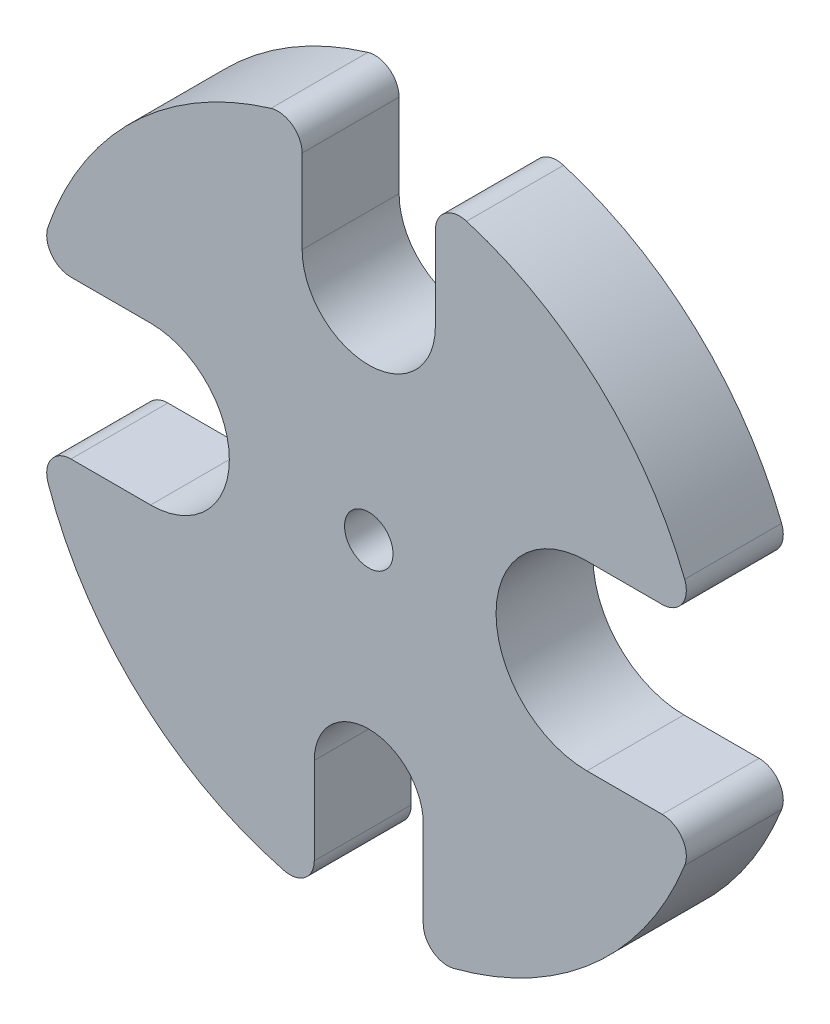
ISO-10303-21;
HEADER;
FILE_DESCRIPTION(('STEP AP214'),'2;1');
FILE_NAME('part.step','',(''),(''),'','','');
FILE_SCHEMA(('AUTOMOTIVE_DESIGN { 1 0 10303 214 1 1 1 1 }'));
ENDSEC;
DATA;
#1=APPLICATION_CONTEXT('core data for automotive mechanical design processes');
#2=APPLICATION_PROTOCOL_DEFINITION('international standard','automotive_design',2000,#1);
#3=PRODUCT_CONTEXT('',#1,'mechanical');
#4=PRODUCT('Part','Part','',(#3));
#5=PRODUCT_RELATED_PRODUCT_CATEGORY('part','',(#4));
#6=PRODUCT_DEFINITION_FORMATION('','',#4);
#7=PRODUCT_DEFINITION_CONTEXT('part definition',#1,'design');
#8=PRODUCT_DEFINITION('design','',#6,#7);
#9=PRODUCT_DEFINITION_SHAPE('','',#8);
#10=(LENGTH_UNIT() NAMED_UNIT(*) SI_UNIT(.MILLI.,.METRE.));
#11=(NAMED_UNIT(*) PLANE_ANGLE_UNIT() SI_UNIT($,.RADIAN.));
#12=(NAMED_UNIT(*) SI_UNIT($,.STERADIAN.) SOLID_ANGLE_UNIT());
#13=UNCERTAINTY_MEASURE_WITH_UNIT(LENGTH_MEASURE(1.E-05),#10,'distance_accuracy_value','');
#14=(GEOMETRIC_REPRESENTATION_CONTEXT(3) GLOBAL_UNCERTAINTY_ASSIGNED_CONTEXT((#13)) GLOBAL_UNIT_ASSIGNED_CONTEXT((#10,
#11,#12)) REPRESENTATION_CONTEXT('',''));
#15=CARTESIAN_POINT('',(0.,0.,0.));
#16=DIRECTION('',(0.,0.,1.));
#17=DIRECTION('',(1.,0.,0.));
#18=AXIS2_PLACEMENT_3D('',#15,#16,#17);
#19=CARTESIAN_POINT('',(-11.8999038146977,39.5223743542896,0.));
#20=DIRECTION('',(0.,0.,1.));
#21=DIRECTION('',(1.,0.,0.));
#22=AXIS2_PLACEMENT_3D('',#19,#20,#21);
#23=CYLINDRICAL_SURFACE('',#22,3.17500000000016);
#24=CARTESIAN_POINT('',(-11.8999038146977,39.5223743542896,12.7));
#25=DIRECTION('',(0.,0.,1.));
#26=DIRECTION('',(1.,0.,0.));
#27=AXIS2_PLACEMENT_3D('',#24,#25,#26);
#28=CIRCLE('',#27,3.17500000000016);
#29=CARTESIAN_POINT('',(-8.72490381469766,39.5223743542897,12.7));
#30=VERTEX_POINT('',#29);
#31=CARTESIAN_POINT('',(-12.8152807377747,42.5625569291853,12.7));
#32=VERTEX_POINT('',#31);
#33=EDGE_CURVE('E181',#30,#32,#28,.T.);
#34=ORIENTED_EDGE('',*,*,#33,.F.);
#35=DIRECTION('',(0.,0.,1.));
#36=VECTOR('',#35,1.);
#37=CARTESIAN_POINT('',(-8.72490381469766,39.5223743542898,6.34999999999999));
#38=LINE('',#37,#36);
#39=CARTESIAN_POINT('',(-8.72490381469766,39.5223743542897,0.));
#40=VERTEX_POINT('',#39);
#41=EDGE_CURVE('E178',#40,#30,#38,.T.);
#42=ORIENTED_EDGE('',*,*,#41,.F.);
#43=CARTESIAN_POINT('',(-11.8999038146977,39.5223743542896,0.));
#44=DIRECTION('',(0.,0.,1.));
#45=DIRECTION('',(1.,0.,0.));
#46=AXIS2_PLACEMENT_3D('',#43,#44,#45);
#47=CIRCLE('',#46,3.17500000000016);
#48=CARTESIAN_POINT('',(-12.8152807377747,42.5625569291852,0.));
#49=VERTEX_POINT('',#48);
#50=EDGE_CURVE('E21',#49,#40,#47,.F.);
#51=ORIENTED_EDGE('',*,*,#50,.F.);
#52=DIRECTION('',(0.,0.,-1.));
#53=VECTOR('',#52,1.);
#54=CARTESIAN_POINT('',(-12.8152807377746,42.5625569291853,6.35));
#55=LINE('',#54,#53);
#56=EDGE_CURVE('E242',#32,#49,#55,.T.);
#57=ORIENTED_EDGE('',*,*,#56,.F.);
#58=EDGE_LOOP('',(#34,#42,#51,#57));
#59=FACE_BOUND('',#58,.T.);
#60=ADVANCED_FACE('F17',(#59),#23,.T.);
#61=CARTESIAN_POINT('',(-3.81469748237523E-06,8.80648001570783E-07,12.7));
#62=DIRECTION('',(0.,0.,-1.));
#63=DIRECTION('',(0.,1.,0.));
#64=AXIS2_PLACEMENT_3D('',#61,#62,#63);
#65=CYLINDRICAL_SURFACE('',#64,44.4500000000004);
#66=DIRECTION('',(0.,0.,-1.));
#67=VECTOR('',#66,1.);
#68=CARTESIAN_POINT('',(-42.0098836461129,14.5248931883406,6.35));
#69=LINE('',#68,#67);
#70=CARTESIAN_POINT('',(-42.0098836461129,14.5248931883406,12.7));
#71=VERTEX_POINT('',#70);
#72=CARTESIAN_POINT('',(-42.0098836461129,14.5248931883406,0.));
#73=VERTEX_POINT('',#72);
#74=EDGE_CURVE('E240',#71,#73,#69,.T.);
#75=ORIENTED_EDGE('',*,*,#74,.F.);
#76=CARTESIAN_POINT('',(-3.81469748237523E-06,8.80648001570783E-07,12.7));
#77=DIRECTION('',(0.,0.,-1.));
#78=DIRECTION('',(0.,1.,0.));
#79=AXIS2_PLACEMENT_3D('',#76,#77,#78);
#80=CIRCLE('',#79,44.4500000000004);
#81=EDGE_CURVE('E296',#32,#71,#80,.F.);
#82=ORIENTED_EDGE('',*,*,#81,.F.);
#83=ORIENTED_EDGE('',*,*,#56,.T.);
#84=CARTESIAN_POINT('',(-3.81469748090083E-06,8.80648000035547E-07,0.));
#85=DIRECTION('',(0.,0.,-1.));
#86=DIRECTION('',(0.,1.,0.));
#87=AXIS2_PLACEMENT_3D('',#84,#85,#86);
#88=CIRCLE('',#87,44.4500000000004);
#89=EDGE_CURVE('E197',#73,#49,#88,.T.);
#90=ORIENTED_EDGE('',*,*,#89,.F.);
#91=EDGE_LOOP('',(#75,#82,#83,#90));
#92=FACE_BOUND('',#91,.T.);
#93=ADVANCED_FACE('F458',(#92),#65,.T.);
#94=CARTESIAN_POINT('',(-39.0091779438692,13.4874008806484,12.7));
#95=DIRECTION('',(0.,0.,-1.));
#96=DIRECTION('',(-1.,0.,0.));
#97=AXIS2_PLACEMENT_3D('',#94,#95,#96);
#98=CYLINDRICAL_SURFACE('',#97,3.17499999999972);
#99=CARTESIAN_POINT('',(-39.0091779438692,13.4874008806484,0.));
#100=DIRECTION('',(0.,0.,-1.));
#101=DIRECTION('',(-1.,0.,0.));
#102=AXIS2_PLACEMENT_3D('',#99,#100,#101);
#103=CIRCLE('',#102,3.17499999999972);
#104=CARTESIAN_POINT('',(-39.009177943869,10.3124008806483,0.));
#105=VERTEX_POINT('',#104);
#106=EDGE_CURVE('E301',#105,#73,#103,.T.);
#107=ORIENTED_EDGE('',*,*,#106,.F.);
#108=DIRECTION('',(0.,0.,-1.));
#109=VECTOR('',#108,1.);
#110=CARTESIAN_POINT('',(-39.0091779438688,10.3124008806483,6.34999999999999));
#111=LINE('',#110,#109);
#112=CARTESIAN_POINT('',(-39.009177943869,10.3124008806483,12.7));
#113=VERTEX_POINT('',#112);
#114=EDGE_CURVE('E238',#113,#105,#111,.T.);
#115=ORIENTED_EDGE('',*,*,#114,.F.);
#116=CARTESIAN_POINT('',(-39.0091779438692,13.4874008806484,12.7));
#117=DIRECTION('',(0.,0.,-1.));
#118=DIRECTION('',(-1.,0.,0.));
#119=AXIS2_PLACEMENT_3D('',#116,#117,#118);
#120=CIRCLE('',#119,3.17499999999972);
#121=EDGE_CURVE('E293',#71,#113,#120,.F.);
#122=ORIENTED_EDGE('',*,*,#121,.F.);
#123=ORIENTED_EDGE('',*,*,#74,.T.);
#124=EDGE_LOOP('',(#107,#115,#122,#123));
#125=FACE_BOUND('',#124,.T.);
#126=ADVANCED_FACE('F455',(#125),#98,.T.);
#127=CARTESIAN_POINT('',(-28.5650038146978,10.3124008806483,-0.0100000000000033));
#128=DIRECTION('',(0.,-1.,0.));
#129=DIRECTION('',(0.,0.,1.));
#130=AXIS2_PLACEMENT_3D('',#127,#128,#129);
#131=PLANE('',#130);
#132=DIRECTION('',(0.,0.,-1.));
#133=VECTOR('',#132,1.);
#134=CARTESIAN_POINT('',(-28.5750038146977,10.3124008806483,6.35));
#135=LINE('',#134,#133);
#136=CARTESIAN_POINT('',(-28.5750038146977,10.3124008806483,12.7));
#137=VERTEX_POINT('',#136);
#138=CARTESIAN_POINT('',(-28.5750038146977,10.3124008806483,0.));
#139=VERTEX_POINT('',#138);
#140=EDGE_CURVE('E236',#137,#139,#135,.T.);
#141=ORIENTED_EDGE('',*,*,#140,.F.);
#142=DIRECTION('',(1.,0.,0.));
#143=VECTOR('',#142,1.);
#144=CARTESIAN_POINT('',(-0.276280140841328,10.3124008806483,12.7));
#145=LINE('',#144,#143);
#146=EDGE_CURVE('E292',#113,#137,#145,.T.);
#147=ORIENTED_EDGE('',*,*,#146,.F.);
#148=ORIENTED_EDGE('',*,*,#114,.T.);
#149=DIRECTION('',(-1.,0.,0.));
#150=VECTOR('',#149,1.);
#151=CARTESIAN_POINT('',(-0.276280140841328,10.3124008806483,0.));
#152=LINE('',#151,#150);
#153=EDGE_CURVE('E303',#139,#105,#152,.T.);
#154=ORIENTED_EDGE('',*,*,#153,.F.);
#155=EDGE_LOOP('',(#141,#147,#148,#154));
#156=FACE_BOUND('',#155,.T.);
#157=ADVANCED_FACE('F451',(#156),#131,.T.);
#158=CARTESIAN_POINT('',(-28.5750038146977,8.80648313152132E-07,12.7));
#159=DIRECTION('',(0.,0.,-1.));
#160=DIRECTION('',(-1.,0.,0.));
#161=AXIS2_PLACEMENT_3D('',#158,#159,#160);
#162=CYLINDRICAL_SURFACE('',#161,10.3124);
#163=CARTESIAN_POINT('',(-28.5750038146977,8.80648313152132E-07,12.7));
#164=DIRECTION('',(0.,0.,-1.));
#165=DIRECTION('',(-1.,0.,0.));
#166=AXIS2_PLACEMENT_3D('',#163,#164,#165);
#167=CIRCLE('',#166,10.3124);
#168=CARTESIAN_POINT('',(-28.5750038146977,-10.3123991193517,12.7));
#169=VERTEX_POINT('',#168);
#170=EDGE_CURVE('E289',#137,#169,#167,.T.);
#171=ORIENTED_EDGE('',*,*,#170,.F.);
#172=ORIENTED_EDGE('',*,*,#140,.T.);
#173=CARTESIAN_POINT('',(-28.5750038146977,8.80648313152132E-07,0.));
#174=DIRECTION('',(0.,0.,-1.));
#175=DIRECTION('',(-1.,0.,0.));
#176=AXIS2_PLACEMENT_3D('',#173,#174,#175);
#177=CIRCLE('',#176,10.3124);
#178=CARTESIAN_POINT('',(-28.5750038146977,-10.3123991193517,0.));
#179=VERTEX_POINT('',#178);
#180=EDGE_CURVE('E304',#179,#139,#177,.F.);
#181=ORIENTED_EDGE('',*,*,#180,.F.);
#182=DIRECTION('',(0.,0.,-1.));
#183=VECTOR('',#182,1.);
#184=CARTESIAN_POINT('',(-28.5750038146977,-10.3123991193517,6.34999999999999));
#185=LINE('',#184,#183);
#186=EDGE_CURVE('E234',#169,#179,#185,.T.);
#187=ORIENTED_EDGE('',*,*,#186,.F.);
#188=EDGE_LOOP('',(#171,#172,#181,#187));
#189=FACE_BOUND('',#188,.T.);
#190=ADVANCED_FACE('F448',(#189),#162,.F.);
#191=CARTESIAN_POINT('',(-28.5650038146978,-10.3123991193517,12.71));
#192=DIRECTION('',(0.,1.,0.));
#193=DIRECTION('',(0.,0.,-1.));
#194=AXIS2_PLACEMENT_3D('',#191,#192,#193);
#195=PLANE('',#194);
#196=ORIENTED_EDGE('',*,*,#186,.T.);
#197=DIRECTION('',(1.,0.,0.));
#198=VECTOR('',#197,1.);
#199=CARTESIAN_POINT('',(-0.276280140841328,-10.3123991193517,0.));
#200=LINE('',#199,#198);
#201=CARTESIAN_POINT('',(-39.0091779438687,-10.3123991193517,0.));
#202=VERTEX_POINT('',#201);
#203=EDGE_CURVE('E307',#202,#179,#200,.T.);
#204=ORIENTED_EDGE('',*,*,#203,.F.);
#205=DIRECTION('',(0.,0.,-1.));
#206=VECTOR('',#205,1.);
#207=CARTESIAN_POINT('',(-39.0091779438688,-10.3123991193517,6.35));
#208=LINE('',#207,#206);
#209=CARTESIAN_POINT('',(-39.0091779438687,-10.3123991193517,12.7));
#210=VERTEX_POINT('',#209);
#211=EDGE_CURVE('E232',#210,#202,#208,.T.);
#212=ORIENTED_EDGE('',*,*,#211,.F.);
#213=DIRECTION('',(-1.,0.,0.));
#214=VECTOR('',#213,1.);
#215=CARTESIAN_POINT('',(-0.276280140841328,-10.3123991193517,12.7));
#216=LINE('',#215,#214);
#217=EDGE_CURVE('E288',#169,#210,#216,.T.);
#218=ORIENTED_EDGE('',*,*,#217,.F.);
#219=EDGE_LOOP('',(#196,#204,#212,#218));
#220=FACE_BOUND('',#219,.T.);
#221=ADVANCED_FACE('F443',(#220),#195,.T.);
#222=CARTESIAN_POINT('',(-39.0091779438687,-13.4873991193517,0.));
#223=DIRECTION('',(0.,0.,1.));
#224=DIRECTION('',(1.,0.,0.));
#225=AXIS2_PLACEMENT_3D('',#222,#223,#224);
#226=CYLINDRICAL_SURFACE('',#225,3.1750000000001);
#227=CARTESIAN_POINT('',(-39.0091779438687,-13.4873991193517,12.7));
#228=DIRECTION('',(0.,0.,1.));
#229=DIRECTION('',(1.,0.,0.));
#230=AXIS2_PLACEMENT_3D('',#227,#228,#229);
#231=CIRCLE('',#230,3.1750000000001);
#232=CARTESIAN_POINT('',(-42.0098836461127,-14.524891427044,12.7));
#233=VERTEX_POINT('',#232);
#234=EDGE_CURVE('E285',#210,#233,#231,.T.);
#235=ORIENTED_EDGE('',*,*,#234,.F.);
#236=ORIENTED_EDGE('',*,*,#211,.T.);
#237=CARTESIAN_POINT('',(-39.0091779438687,-13.4873991193517,0.));
#238=DIRECTION('',(0.,0.,1.));
#239=DIRECTION('',(1.,0.,0.));
#240=AXIS2_PLACEMENT_3D('',#237,#238,#239);
#241=CIRCLE('',#240,3.1750000000001);
#242=CARTESIAN_POINT('',(-42.0098836461127,-14.524891427044,0.));
#243=VERTEX_POINT('',#242);
#244=EDGE_CURVE('E308',#243,#202,#241,.F.);
#245=ORIENTED_EDGE('',*,*,#244,.F.);
#246=DIRECTION('',(0.,0.,-1.));
#247=VECTOR('',#246,1.);
#248=CARTESIAN_POINT('',(-42.0098836461127,-14.524891427044,6.35));
#249=LINE('',#248,#247);
#250=EDGE_CURVE('E230',#233,#243,#249,.T.);
#251=ORIENTED_EDGE('',*,*,#250,.F.);
#252=EDGE_LOOP('',(#235,#236,#245,#251));
#253=FACE_BOUND('',#252,.T.);
#254=ADVANCED_FACE('F439',(#253),#226,.T.);
#255=CARTESIAN_POINT('',(-3.8146980678444E-06,8.8064784544567E-07,12.7));
#256=DIRECTION('',(0.,0.,-1.));
#257=DIRECTION('',(-1.,0.,0.));
#258=AXIS2_PLACEMENT_3D('',#255,#256,#257);
#259=CYLINDRICAL_SURFACE('',#258,44.4499999999994);
#260=ORIENTED_EDGE('',*,*,#250,.T.);
#261=CARTESIAN_POINT('',(-3.8146980678444E-06,8.8064784544567E-07,0.));
#262=DIRECTION('',(0.,0.,-1.));
#263=DIRECTION('',(-1.,0.,0.));
#264=AXIS2_PLACEMENT_3D('',#261,#262,#263);
#265=CIRCLE('',#264,44.4499999999994);
#266=CARTESIAN_POINT('',(-11.1056653531593,-43.0402916577759,0.));
#267=VERTEX_POINT('',#266);
#268=EDGE_CURVE('E311',#267,#243,#265,.T.);
#269=ORIENTED_EDGE('',*,*,#268,.F.);
#270=DIRECTION('',(0.,0.,-1.));
#271=VECTOR('',#270,1.);
#272=CARTESIAN_POINT('',(-11.1056653531592,-43.0402916577759,6.35));
#273=LINE('',#272,#271);
#274=CARTESIAN_POINT('',(-11.1056653531593,-43.0402916577759,12.7));
#275=VERTEX_POINT('',#274);
#276=EDGE_CURVE('E228',#275,#267,#273,.T.);
#277=ORIENTED_EDGE('',*,*,#276,.F.);
#278=CARTESIAN_POINT('',(-3.8146980678444E-06,8.8064784544567E-07,12.7));
#279=DIRECTION('',(0.,0.,-1.));
#280=DIRECTION('',(-1.,0.,0.));
#281=AXIS2_PLACEMENT_3D('',#278,#279,#280);
#282=CIRCLE('',#281,44.4499999999994);
#283=EDGE_CURVE('E282',#233,#275,#282,.F.);
#284=ORIENTED_EDGE('',*,*,#283,.F.);
#285=EDGE_LOOP('',(#260,#269,#277,#284));
#286=FACE_BOUND('',#285,.T.);
#287=ADVANCED_FACE('F435',(#286),#259,.T.);
#288=CARTESIAN_POINT('',(-10.3124038146977,-39.965985047888,12.7));
#289=DIRECTION('',(0.,0.,-1.));
#290=DIRECTION('',(-1.,0.,0.));
#291=AXIS2_PLACEMENT_3D('',#288,#289,#290);
#292=CYLINDRICAL_SURFACE('',#291,3.17500000000044);
#293=CARTESIAN_POINT('',(-10.3124038146977,-39.965985047888,0.));
#294=DIRECTION('',(0.,0.,-1.));
#295=DIRECTION('',(-1.,0.,0.));
#296=AXIS2_PLACEMENT_3D('',#293,#294,#295);
#297=CIRCLE('',#296,3.17500000000044);
#298=CARTESIAN_POINT('',(-7.13740381469765,-39.9659850478883,0.));
#299=VERTEX_POINT('',#298);
#300=EDGE_CURVE('E314',#299,#267,#297,.T.);
#301=ORIENTED_EDGE('',*,*,#300,.F.);
#302=DIRECTION('',(0.,0.,-1.));
#303=VECTOR('',#302,1.);
#304=CARTESIAN_POINT('',(-7.13740381469763,-39.9659850478886,6.34999999999999));
#305=LINE('',#304,#303);
#306=CARTESIAN_POINT('',(-7.13740381469764,-39.9659850478883,12.7));
#307=VERTEX_POINT('',#306);
#308=EDGE_CURVE('E226',#307,#299,#305,.T.);
#309=ORIENTED_EDGE('',*,*,#308,.F.);
#310=CARTESIAN_POINT('',(-10.3124038146977,-39.965985047888,12.7));
#311=DIRECTION('',(0.,0.,-1.));
#312=DIRECTION('',(-1.,0.,0.));
#313=AXIS2_PLACEMENT_3D('',#310,#311,#312);
#314=CIRCLE('',#313,3.17500000000044);
#315=EDGE_CURVE('E279',#275,#307,#314,.F.);
#316=ORIENTED_EDGE('',*,*,#315,.F.);
#317=ORIENTED_EDGE('',*,*,#276,.T.);
#318=EDGE_LOOP('',(#301,#309,#316,#317));
#319=FACE_BOUND('',#318,.T.);
#320=ADVANCED_FACE('F431',(#319),#292,.T.);
#321=CARTESIAN_POINT('',(-7.13740381469766,-28.5649991193516,-0.0100000000000033));
#322=DIRECTION('',(1.,0.,0.));
#323=DIRECTION('',(0.,0.,1.));
#324=AXIS2_PLACEMENT_3D('',#321,#322,#323);
#325=PLANE('',#324);
#326=DIRECTION('',(0.,0.,-1.));
#327=VECTOR('',#326,1.);
#328=CARTESIAN_POINT('',(-7.13740381469766,-28.5749991193518,6.35));
#329=LINE('',#328,#327);
#330=CARTESIAN_POINT('',(-7.13740381469765,-28.5749991193518,12.7));
#331=VERTEX_POINT('',#330);
#332=CARTESIAN_POINT('',(-7.13740381469766,-28.5749991193518,0.));
#333=VERTEX_POINT('',#332);
#334=EDGE_CURVE('E224',#331,#333,#329,.T.);
#335=ORIENTED_EDGE('',*,*,#334,.F.);
#336=DIRECTION('',(0.,1.,0.));
#337=VECTOR('',#336,1.);
#338=CARTESIAN_POINT('',(-7.13740381469764,-0.203236700360557,12.7));
#339=LINE('',#338,#337);
#340=EDGE_CURVE('E278',#307,#331,#339,.T.);
#341=ORIENTED_EDGE('',*,*,#340,.F.);
#342=ORIENTED_EDGE('',*,*,#308,.T.);
#343=DIRECTION('',(0.,-1.,0.));
#344=VECTOR('',#343,1.);
#345=CARTESIAN_POINT('',(-7.13740381469766,-0.203236700360557,0.));
#346=LINE('',#345,#344);
#347=EDGE_CURVE('E317',#333,#299,#346,.T.);
#348=ORIENTED_EDGE('',*,*,#347,.F.);
#349=EDGE_LOOP('',(#335,#341,#342,#348));
#350=FACE_BOUND('',#349,.T.);
#351=ADVANCED_FACE('F427',(#350),#325,.T.);
#352=CARTESIAN_POINT('',(-3.81469764044559E-06,-28.5749991193518,12.7));
#353=DIRECTION('',(0.,0.,-1.));
#354=DIRECTION('',(-1.,0.,0.));
#355=AXIS2_PLACEMENT_3D('',#352,#353,#354);
#356=CYLINDRICAL_SURFACE('',#355,7.13740000000007);
#357=CARTESIAN_POINT('',(-3.81469764044559E-06,-28.5749991193518,12.7));
#358=DIRECTION('',(0.,0.,-1.));
#359=DIRECTION('',(-1.,0.,0.));
#360=AXIS2_PLACEMENT_3D('',#357,#358,#359);
#361=CIRCLE('',#360,7.13740000000007);
#362=CARTESIAN_POINT('',(7.13739618530235,-28.5749991193518,12.7));
#363=VERTEX_POINT('',#362);
#364=EDGE_CURVE('E275',#331,#363,#361,.T.);
#365=ORIENTED_EDGE('',*,*,#364,.F.);
#366=ORIENTED_EDGE('',*,*,#334,.T.);
#367=CARTESIAN_POINT('',(-3.81469764044559E-06,-28.5749991193518,0.));
#368=DIRECTION('',(0.,0.,-1.));
#369=DIRECTION('',(-1.,0.,0.));
#370=AXIS2_PLACEMENT_3D('',#367,#368,#369);
#371=CIRCLE('',#370,7.13740000000007);
#372=CARTESIAN_POINT('',(7.13739618530236,-28.5749991193518,0.));
#373=VERTEX_POINT('',#372);
#374=EDGE_CURVE('E318',#373,#333,#371,.F.);
#375=ORIENTED_EDGE('',*,*,#374,.F.);
#376=DIRECTION('',(0.,0.,-1.));
#377=VECTOR('',#376,1.);
#378=CARTESIAN_POINT('',(7.13739618530235,-28.5749991193518,6.34999999999999));
#379=LINE('',#378,#377);
#380=EDGE_CURVE('E222',#363,#373,#379,.T.);
#381=ORIENTED_EDGE('',*,*,#380,.F.);
#382=EDGE_LOOP('',(#365,#366,#375,#381));
#383=FACE_BOUND('',#382,.T.);
#384=ADVANCED_FACE('F424',(#383),#356,.F.);
#385=CARTESIAN_POINT('',(7.13739618530235,-28.5649991193516,12.71));
#386=DIRECTION('',(-1.,0.,0.));
#387=DIRECTION('',(0.,0.,-1.));
#388=AXIS2_PLACEMENT_3D('',#385,#386,#387);
#389=PLANE('',#388);
#390=ORIENTED_EDGE('',*,*,#380,.T.);
#391=DIRECTION('',(0.,1.,0.));
#392=VECTOR('',#391,1.);
#393=CARTESIAN_POINT('',(7.13739618530238,-0.203236700360557,0.));
#394=LINE('',#393,#392);
#395=CARTESIAN_POINT('',(7.13739618530237,-39.9659850478883,0.));
#396=VERTEX_POINT('',#395);
#397=EDGE_CURVE('E321',#396,#373,#394,.T.);
#398=ORIENTED_EDGE('',*,*,#397,.F.);
#399=DIRECTION('',(0.,0.,-1.));
#400=VECTOR('',#399,1.);
#401=CARTESIAN_POINT('',(7.13739618530237,-39.9659850478886,6.35));
#402=LINE('',#401,#400);
#403=CARTESIAN_POINT('',(7.13739618530236,-39.9659850478883,12.7));
#404=VERTEX_POINT('',#403);
#405=EDGE_CURVE('E220',#404,#396,#402,.T.);
#406=ORIENTED_EDGE('',*,*,#405,.F.);
#407=DIRECTION('',(0.,-1.,0.));
#408=VECTOR('',#407,1.);
#409=CARTESIAN_POINT('',(7.13739618530235,-0.203236700360557,12.7));
#410=LINE('',#409,#408);
#411=EDGE_CURVE('E274',#363,#404,#410,.T.);
#412=ORIENTED_EDGE('',*,*,#411,.F.);
#413=EDGE_LOOP('',(#390,#398,#406,#412));
#414=FACE_BOUND('',#413,.T.);
#415=ADVANCED_FACE('F419',(#414),#389,.T.);
#416=CARTESIAN_POINT('',(10.3123961853024,-39.965985047888,0.));
#417=DIRECTION('',(0.,0.,1.));
#418=DIRECTION('',(1.,0.,0.));
#419=AXIS2_PLACEMENT_3D('',#416,#417,#418);
#420=CYLINDRICAL_SURFACE('',#419,3.17500000000044);
#421=CARTESIAN_POINT('',(10.3123961853024,-39.965985047888,12.7));
#422=DIRECTION('',(0.,0.,1.));
#423=DIRECTION('',(1.,0.,0.));
#424=AXIS2_PLACEMENT_3D('',#421,#422,#423);
#425=CIRCLE('',#424,3.17500000000044);
#426=CARTESIAN_POINT('',(11.105657723764,-43.0402916577759,12.7));
#427=VERTEX_POINT('',#426);
#428=EDGE_CURVE('E271',#404,#427,#425,.T.);
#429=ORIENTED_EDGE('',*,*,#428,.F.);
#430=ORIENTED_EDGE('',*,*,#405,.T.);
#431=CARTESIAN_POINT('',(10.3123961853024,-39.965985047888,0.));
#432=DIRECTION('',(0.,0.,1.));
#433=DIRECTION('',(1.,0.,0.));
#434=AXIS2_PLACEMENT_3D('',#431,#432,#433);
#435=CIRCLE('',#434,3.17500000000044);
#436=CARTESIAN_POINT('',(11.105657723764,-43.0402916577759,0.));
#437=VERTEX_POINT('',#436);
#438=EDGE_CURVE('E322',#437,#396,#435,.F.);
#439=ORIENTED_EDGE('',*,*,#438,.F.);
#440=DIRECTION('',(0.,0.,-1.));
#441=VECTOR('',#440,1.);
#442=CARTESIAN_POINT('',(11.1056577237639,-43.0402916577759,6.35));
#443=LINE('',#442,#441);
#444=EDGE_CURVE('E218',#427,#437,#443,.T.);
#445=ORIENTED_EDGE('',*,*,#444,.F.);
#446=EDGE_LOOP('',(#429,#430,#439,#445));
#447=FACE_BOUND('',#446,.T.);
#448=ADVANCED_FACE('F415',(#447),#420,.T.);
#449=CARTESIAN_POINT('',(-3.81469795508738E-06,8.80648774390091E-07,12.7));
#450=DIRECTION('',(0.,0.,-1.));
#451=DIRECTION('',(0.,1.,0.));
#452=AXIS2_PLACEMENT_3D('',#449,#450,#451);
#453=CYLINDRICAL_SURFACE('',#452,44.4500000000005);
#454=DIRECTION('',(0.,0.,-1.));
#455=VECTOR('',#454,1.);
#456=CARTESIAN_POINT('',(41.3792574158802,-16.2345068116594,6.35));
#457=LINE('',#456,#455);
#458=CARTESIAN_POINT('',(41.3792574158802,-16.2345068116594,12.7));
#459=VERTEX_POINT('',#458);
#460=CARTESIAN_POINT('',(41.3792574158802,-16.2345068116594,0.));
#461=VERTEX_POINT('',#460);
#462=EDGE_CURVE('E216',#459,#461,#457,.T.);
#463=ORIENTED_EDGE('',*,*,#462,.F.);
#464=CARTESIAN_POINT('',(-3.81469795508738E-06,8.80648774390091E-07,12.7));
#465=DIRECTION('',(0.,0.,-1.));
#466=DIRECTION('',(0.,1.,0.));
#467=AXIS2_PLACEMENT_3D('',#464,#465,#466);
#468=CIRCLE('',#467,44.4500000000005);
#469=EDGE_CURVE('E268',#427,#459,#468,.F.);
#470=ORIENTED_EDGE('',*,*,#469,.F.);
#471=ORIENTED_EDGE('',*,*,#444,.T.);
#472=CARTESIAN_POINT('',(-3.81469795650177E-06,8.80648775987461E-07,0.));
#473=DIRECTION('',(0.,0.,-1.));
#474=DIRECTION('',(0.,1.,0.));
#475=AXIS2_PLACEMENT_3D('',#472,#473,#474);
#476=CIRCLE('',#475,44.4500000000005);
#477=EDGE_CURVE('E325',#461,#437,#476,.T.);
#478=ORIENTED_EDGE('',*,*,#477,.F.);
#479=EDGE_LOOP('',(#463,#470,#471,#478));
#480=FACE_BOUND('',#479,.T.);
#481=ADVANCED_FACE('F411',(#480),#453,.T.);
#482=CARTESIAN_POINT('',(38.4235958994101,-15.0748991193517,12.7));
#483=DIRECTION('',(0.,0.,-1.));
#484=DIRECTION('',(-1.,0.,0.));
#485=AXIS2_PLACEMENT_3D('',#482,#483,#484);
#486=CYLINDRICAL_SURFACE('',#485,3.17500000000026);
#487=CARTESIAN_POINT('',(38.4235958994101,-15.0748991193517,0.));
#488=DIRECTION('',(0.,0.,-1.));
#489=DIRECTION('',(-1.,0.,0.));
#490=AXIS2_PLACEMENT_3D('',#487,#488,#489);
#491=CIRCLE('',#490,3.17500000000026);
#492=CARTESIAN_POINT('',(38.4235958994103,-11.8998991193517,0.));
#493=VERTEX_POINT('',#492);
#494=EDGE_CURVE('E328',#493,#461,#491,.T.);
#495=ORIENTED_EDGE('',*,*,#494,.F.);
#496=DIRECTION('',(0.,0.,-1.));
#497=VECTOR('',#496,1.);
#498=CARTESIAN_POINT('',(38.4235958994104,-11.8998991193517,6.34999999999999));
#499=LINE('',#498,#497);
#500=CARTESIAN_POINT('',(38.4235958994103,-11.8998991193517,12.7));
#501=VERTEX_POINT('',#500);
#502=EDGE_CURVE('E214',#501,#493,#499,.T.);
#503=ORIENTED_EDGE('',*,*,#502,.F.);
#504=CARTESIAN_POINT('',(38.4235958994101,-15.0748991193517,12.7));
#505=DIRECTION('',(0.,0.,-1.));
#506=DIRECTION('',(-1.,0.,0.));
#507=AXIS2_PLACEMENT_3D('',#504,#505,#506);
#508=CIRCLE('',#507,3.17500000000026);
#509=EDGE_CURVE('E265',#459,#501,#508,.F.);
#510=ORIENTED_EDGE('',*,*,#509,.F.);
#511=ORIENTED_EDGE('',*,*,#462,.T.);
#512=EDGE_LOOP('',(#495,#503,#510,#511));
#513=FACE_BOUND('',#512,.T.);
#514=ADVANCED_FACE('F407',(#513),#486,.T.);
#515=CARTESIAN_POINT('',(38.4335958994104,-11.8998991193517,12.71));
#516=DIRECTION('',(0.,1.,0.));
#517=DIRECTION('',(0.,0.,-1.));
#518=AXIS2_PLACEMENT_3D('',#515,#516,#517);
#519=PLANE('',#518);
#520=DIRECTION('',(0.,0.,-1.));
#521=VECTOR('',#520,1.);
#522=CARTESIAN_POINT('',(28.5749961853023,-11.8998991193517,6.35));
#523=LINE('',#522,#521);
#524=CARTESIAN_POINT('',(28.5749961853023,-11.8998991193517,12.7));
#525=VERTEX_POINT('',#524);
#526=CARTESIAN_POINT('',(28.5749961853023,-11.8998991193517,0.));
#527=VERTEX_POINT('',#526);
#528=EDGE_CURVE('E212',#525,#527,#523,.T.);
#529=ORIENTED_EDGE('',*,*,#528,.F.);
#530=DIRECTION('',(-1.,0.,0.));
#531=VECTOR('',#530,1.);
#532=CARTESIAN_POINT('',(-0.276280140841328,-11.8998991193517,12.7));
#533=LINE('',#532,#531);
#534=EDGE_CURVE('E264',#501,#525,#533,.T.);
#535=ORIENTED_EDGE('',*,*,#534,.F.);
#536=ORIENTED_EDGE('',*,*,#502,.T.);
#537=DIRECTION('',(1.,0.,0.));
#538=VECTOR('',#537,1.);
#539=CARTESIAN_POINT('',(-0.276280140841328,-11.8998991193517,0.));
#540=LINE('',#539,#538);
#541=EDGE_CURVE('E331',#527,#493,#540,.T.);
#542=ORIENTED_EDGE('',*,*,#541,.F.);
#543=EDGE_LOOP('',(#529,#535,#536,#542));
#544=FACE_BOUND('',#543,.T.);
#545=ADVANCED_FACE('F403',(#544),#519,.T.);
#546=CARTESIAN_POINT('',(28.5749961853023,8.80648319973715E-07,12.7));
#547=DIRECTION('',(0.,0.,-1.));
#548=DIRECTION('',(-1.,0.,0.));
#549=AXIS2_PLACEMENT_3D('',#546,#547,#548);
#550=CYLINDRICAL_SURFACE('',#549,11.8999);
#551=CARTESIAN_POINT('',(28.5749961853023,8.80648319973715E-07,12.7));
#552=DIRECTION('',(0.,0.,-1.));
#553=DIRECTION('',(-1.,0.,0.));
#554=AXIS2_PLACEMENT_3D('',#551,#552,#553);
#555=CIRCLE('',#554,11.8999);
#556=CARTESIAN_POINT('',(28.5749961853023,11.8999008806483,12.7));
#557=VERTEX_POINT('',#556);
#558=EDGE_CURVE('E261',#525,#557,#555,.T.);
#559=ORIENTED_EDGE('',*,*,#558,.F.);
#560=ORIENTED_EDGE('',*,*,#528,.T.);
#561=CARTESIAN_POINT('',(28.5749961853023,8.80648319973715E-07,0.));
#562=DIRECTION('',(0.,0.,-1.));
#563=DIRECTION('',(-1.,0.,0.));
#564=AXIS2_PLACEMENT_3D('',#561,#562,#563);
#565=CIRCLE('',#564,11.8999);
#566=CARTESIAN_POINT('',(28.5749961853023,11.8999008806483,0.));
#567=VERTEX_POINT('',#566);
#568=EDGE_CURVE('E332',#567,#527,#565,.F.);
#569=ORIENTED_EDGE('',*,*,#568,.F.);
#570=DIRECTION('',(0.,0.,-1.));
#571=VECTOR('',#570,1.);
#572=CARTESIAN_POINT('',(28.5749961853023,11.8999008806483,6.34999999999999));
#573=LINE('',#572,#571);
#574=EDGE_CURVE('E210',#557,#567,#573,.T.);
#575=ORIENTED_EDGE('',*,*,#574,.F.);
#576=EDGE_LOOP('',(#559,#560,#569,#575));
#577=FACE_BOUND('',#576,.T.);
#578=ADVANCED_FACE('F400',(#577),#550,.F.);
#579=CARTESIAN_POINT('',(38.4335958994104,11.8999008806483,-0.0100000000000033));
#580=DIRECTION('',(0.,-1.,0.));
#581=DIRECTION('',(0.,0.,1.));
#582=AXIS2_PLACEMENT_3D('',#579,#580,#581);
#583=PLANE('',#582);
#584=ORIENTED_EDGE('',*,*,#574,.T.);
#585=DIRECTION('',(-1.,0.,0.));
#586=VECTOR('',#585,1.);
#587=CARTESIAN_POINT('',(-0.276280140841325,11.8999008806483,0.));
#588=LINE('',#587,#586);
#589=CARTESIAN_POINT('',(38.4235958994102,11.8999008806483,0.));
#590=VERTEX_POINT('',#589);
#591=EDGE_CURVE('E335',#590,#567,#588,.T.);
#592=ORIENTED_EDGE('',*,*,#591,.F.);
#593=DIRECTION('',(0.,0.,-1.));
#594=VECTOR('',#593,1.);
#595=CARTESIAN_POINT('',(38.4235958994104,11.8999008806483,6.35));
#596=LINE('',#595,#594);
#597=CARTESIAN_POINT('',(38.4235958994102,11.8999008806483,12.7));
#598=VERTEX_POINT('',#597);
#599=EDGE_CURVE('E208',#598,#590,#596,.T.);
#600=ORIENTED_EDGE('',*,*,#599,.F.);
#601=DIRECTION('',(1.,0.,0.));
#602=VECTOR('',#601,1.);
#603=CARTESIAN_POINT('',(-0.276280140841325,11.8999008806483,12.7));
#604=LINE('',#603,#602);
#605=EDGE_CURVE('E260',#557,#598,#604,.T.);
#606=ORIENTED_EDGE('',*,*,#605,.F.);
#607=EDGE_LOOP('',(#584,#592,#600,#606));
#608=FACE_BOUND('',#607,.T.);
#609=ADVANCED_FACE('F395',(#608),#583,.T.);
#610=CARTESIAN_POINT('',(38.4235958994101,15.0749008806484,0.));
#611=DIRECTION('',(0.,0.,1.));
#612=DIRECTION('',(1.,0.,0.));
#613=AXIS2_PLACEMENT_3D('',#610,#611,#612);
#614=CYLINDRICAL_SURFACE('',#613,3.17500000000029);
#615=CARTESIAN_POINT('',(38.4235958994101,15.0749008806484,12.7));
#616=DIRECTION('',(0.,0.,1.));
#617=DIRECTION('',(1.,0.,0.));
#618=AXIS2_PLACEMENT_3D('',#615,#616,#617);
#619=CIRCLE('',#618,3.17500000000029);
#620=CARTESIAN_POINT('',(41.3792574158802,16.2345085729561,12.7));
#621=VERTEX_POINT('',#620);
#622=EDGE_CURVE('E257',#598,#621,#619,.T.);
#623=ORIENTED_EDGE('',*,*,#622,.F.);
#624=ORIENTED_EDGE('',*,*,#599,.T.);
#625=CARTESIAN_POINT('',(38.4235958994101,15.0749008806484,0.));
#626=DIRECTION('',(0.,0.,1.));
#627=DIRECTION('',(1.,0.,0.));
#628=AXIS2_PLACEMENT_3D('',#625,#626,#627);
#629=CIRCLE('',#628,3.17500000000029);
#630=CARTESIAN_POINT('',(41.3792574158802,16.2345085729561,0.));
#631=VERTEX_POINT('',#630);
#632=EDGE_CURVE('E336',#631,#590,#629,.F.);
#633=ORIENTED_EDGE('',*,*,#632,.F.);
#634=DIRECTION('',(0.,0.,-1.));
#635=VECTOR('',#634,1.);
#636=CARTESIAN_POINT('',(41.3792574158802,16.234508572956,6.35));
#637=LINE('',#636,#635);
#638=EDGE_CURVE('E206',#621,#631,#637,.T.);
#639=ORIENTED_EDGE('',*,*,#638,.F.);
#640=EDGE_LOOP('',(#623,#624,#633,#639));
#641=FACE_BOUND('',#640,.T.);
#642=ADVANCED_FACE('F391',(#641),#614,.T.);
#643=CARTESIAN_POINT('',(-3.81469781804422E-06,8.80648082235425E-07,12.7));
#644=DIRECTION('',(0.,0.,-1.));
#645=DIRECTION('',(-1.,0.,0.));
#646=AXIS2_PLACEMENT_3D('',#643,#644,#645);
#647=CYLINDRICAL_SURFACE('',#646,44.4500000000003);
#648=DIRECTION('',(0.,0.,-1.));
#649=VECTOR('',#648,1.);
#650=CARTESIAN_POINT('',(12.8152731083793,42.5625569291853,6.35));
#651=LINE('',#650,#649);
#652=CARTESIAN_POINT('',(12.8152731083793,42.5625569291852,12.7));
#653=VERTEX_POINT('',#652);
#654=CARTESIAN_POINT('',(12.8152731083793,42.5625569291853,0.));
#655=VERTEX_POINT('',#654);
#656=EDGE_CURVE('E204',#653,#655,#651,.T.);
#657=ORIENTED_EDGE('',*,*,#656,.F.);
#658=CARTESIAN_POINT('',(-3.81469781804422E-06,8.80648082235425E-07,12.7));
#659=DIRECTION('',(0.,0.,-1.));
#660=DIRECTION('',(-1.,0.,0.));
#661=AXIS2_PLACEMENT_3D('',#658,#659,#660);
#662=CIRCLE('',#661,44.4500000000003);
#663=EDGE_CURVE('E254',#621,#653,#662,.F.);
#664=ORIENTED_EDGE('',*,*,#663,.F.);
#665=ORIENTED_EDGE('',*,*,#638,.T.);
#666=CARTESIAN_POINT('',(-3.81469781804422E-06,8.80648082235425E-07,0.));
#667=DIRECTION('',(0.,0.,-1.));
#668=DIRECTION('',(-1.,0.,0.));
#669=AXIS2_PLACEMENT_3D('',#666,#667,#668);
#670=CIRCLE('',#669,44.4500000000003);
#671=EDGE_CURVE('E339',#655,#631,#670,.T.);
#672=ORIENTED_EDGE('',*,*,#671,.F.);
#673=EDGE_LOOP('',(#657,#664,#665,#672));
#674=FACE_BOUND('',#673,.T.);
#675=ADVANCED_FACE('F387',(#674),#647,.T.);
#676=CARTESIAN_POINT('',(11.8998961853024,39.5223743542896,12.7));
#677=DIRECTION('',(0.,0.,-1.));
#678=DIRECTION('',(0.,1.,0.));
#679=AXIS2_PLACEMENT_3D('',#676,#677,#678);
#680=CYLINDRICAL_SURFACE('',#679,3.17500000000013);
#681=CARTESIAN_POINT('',(11.8998961853024,39.5223743542896,0.));
#682=DIRECTION('',(0.,0.,-1.));
#683=DIRECTION('',(0.,1.,0.));
#684=AXIS2_PLACEMENT_3D('',#681,#682,#683);
#685=CIRCLE('',#684,3.17500000000013);
#686=CARTESIAN_POINT('',(8.72489618530235,39.5223743542897,0.));
#687=VERTEX_POINT('',#686);
#688=EDGE_CURVE('E342',#687,#655,#685,.T.);
#689=ORIENTED_EDGE('',*,*,#688,.F.);
#690=DIRECTION('',(0.,0.,-1.));
#691=VECTOR('',#690,1.);
#692=CARTESIAN_POINT('',(8.72489618530235,39.5223743542898,6.34999999999999));
#693=LINE('',#692,#691);
#694=CARTESIAN_POINT('',(8.72489618530235,39.5223743542897,12.7));
#695=VERTEX_POINT('',#694);
#696=EDGE_CURVE('E202',#695,#687,#693,.T.);
#697=ORIENTED_EDGE('',*,*,#696,.F.);
#698=CARTESIAN_POINT('',(11.8998961853024,39.5223743542896,12.7));
#699=DIRECTION('',(0.,0.,-1.));
#700=DIRECTION('',(0.,1.,0.));
#701=AXIS2_PLACEMENT_3D('',#698,#699,#700);
#702=CIRCLE('',#701,3.17500000000013);
#703=EDGE_CURVE('E251',#653,#695,#702,.F.);
#704=ORIENTED_EDGE('',*,*,#703,.F.);
#705=ORIENTED_EDGE('',*,*,#656,.T.);
#706=EDGE_LOOP('',(#689,#697,#704,#705));
#707=FACE_BOUND('',#706,.T.);
#708=ADVANCED_FACE('F383',(#707),#680,.T.);
#709=CARTESIAN_POINT('',(8.72489618530235,39.5323743542898,12.71));
#710=DIRECTION('',(-1.,0.,0.));
#711=DIRECTION('',(0.,0.,-1.));
#712=AXIS2_PLACEMENT_3D('',#709,#710,#711);
#713=PLANE('',#712);
#714=DIRECTION('',(0.,0.,-1.));
#715=VECTOR('',#714,1.);
#716=CARTESIAN_POINT('',(8.72489618530235,28.5750008806482,6.35));
#717=LINE('',#716,#715);
#718=CARTESIAN_POINT('',(8.72489618530235,28.5750008806482,12.7));
#719=VERTEX_POINT('',#718);
#720=CARTESIAN_POINT('',(8.72489618530235,28.5750008806482,0.));
#721=VERTEX_POINT('',#720);
#722=EDGE_CURVE('E184',#719,#721,#717,.T.);
#723=ORIENTED_EDGE('',*,*,#722,.F.);
#724=DIRECTION('',(0.,-1.,0.));
#725=VECTOR('',#724,1.);
#726=CARTESIAN_POINT('',(8.72489618530235,-0.203236700360557,12.7));
#727=LINE('',#726,#725);
#728=EDGE_CURVE('E250',#695,#719,#727,.T.);
#729=ORIENTED_EDGE('',*,*,#728,.F.);
#730=ORIENTED_EDGE('',*,*,#696,.T.);
#731=DIRECTION('',(0.,1.,0.));
#732=VECTOR('',#731,1.);
#733=CARTESIAN_POINT('',(8.72489618530235,-0.203236700360557,0.));
#734=LINE('',#733,#732);
#735=EDGE_CURVE('E344',#721,#687,#734,.T.);
#736=ORIENTED_EDGE('',*,*,#735,.F.);
#737=EDGE_LOOP('',(#723,#729,#730,#736));
#738=FACE_BOUND('',#737,.T.);
#739=ADVANCED_FACE('F379',(#738),#713,.T.);
#740=CARTESIAN_POINT('',(-3.81469765455697E-06,28.5750008806482,12.7));
#741=DIRECTION('',(0.,0.,-1.));
#742=DIRECTION('',(-1.,0.,0.));
#743=AXIS2_PLACEMENT_3D('',#740,#741,#742);
#744=CYLINDRICAL_SURFACE('',#743,8.72489999999996);
#745=CARTESIAN_POINT('',(-3.81469765455697E-06,28.5750008806482,12.7));
#746=DIRECTION('',(0.,0.,-1.));
#747=DIRECTION('',(-1.,0.,0.));
#748=AXIS2_PLACEMENT_3D('',#745,#746,#747);
#749=CIRCLE('',#748,8.72489999999996);
#750=CARTESIAN_POINT('',(-8.72490381469766,28.5750008806482,12.7));
#751=VERTEX_POINT('',#750);
#752=EDGE_CURVE('E247',#719,#751,#749,.T.);
#753=ORIENTED_EDGE('',*,*,#752,.F.);
#754=ORIENTED_EDGE('',*,*,#722,.T.);
#755=CARTESIAN_POINT('',(-3.81469765455697E-06,28.5750008806482,0.));
#756=DIRECTION('',(0.,0.,-1.));
#757=DIRECTION('',(-1.,0.,0.));
#758=AXIS2_PLACEMENT_3D('',#755,#756,#757);
#759=CIRCLE('',#758,8.72489999999996);
#760=CARTESIAN_POINT('',(-8.72490381469766,28.5750008806482,0.));
#761=VERTEX_POINT('',#760);
#762=EDGE_CURVE('E191',#761,#721,#759,.F.);
#763=ORIENTED_EDGE('',*,*,#762,.F.);
#764=DIRECTION('',(0.,0.,-1.));
#765=VECTOR('',#764,1.);
#766=CARTESIAN_POINT('',(-8.72490381469766,28.5750008806482,6.34999999999999));
#767=LINE('',#766,#765);
#768=EDGE_CURVE('E36',#751,#761,#767,.T.);
#769=ORIENTED_EDGE('',*,*,#768,.F.);
#770=EDGE_LOOP('',(#753,#754,#763,#769));
#771=FACE_BOUND('',#770,.T.);
#772=ADVANCED_FACE('F377',(#771),#744,.F.);
#773=CARTESIAN_POINT('',(-8.72490381469766,39.5323743542898,-0.0100000000000033));
#774=DIRECTION('',(1.,0.,0.));
#775=DIRECTION('',(0.,0.,1.));
#776=AXIS2_PLACEMENT_3D('',#773,#774,#775);
#777=PLANE('',#776);
#778=ORIENTED_EDGE('',*,*,#768,.T.);
#779=DIRECTION('',(0.,-1.,0.));
#780=VECTOR('',#779,1.);
#781=CARTESIAN_POINT('',(-8.72490381469766,-0.203236700360557,0.));
#782=LINE('',#781,#780);
#783=EDGE_CURVE('E187',#40,#761,#782,.T.);
#784=ORIENTED_EDGE('',*,*,#783,.F.);
#785=ORIENTED_EDGE('',*,*,#41,.T.);
#786=DIRECTION('',(0.,1.,0.));
#787=VECTOR('',#786,1.);
#788=CARTESIAN_POINT('',(-8.72490381469765,-0.203236700360557,12.7));
#789=LINE('',#788,#787);
#790=EDGE_CURVE('E246',#751,#30,#789,.T.);
#791=ORIENTED_EDGE('',*,*,#790,.F.);
#792=EDGE_LOOP('',(#778,#784,#785,#791));
#793=FACE_BOUND('',#792,.T.);
#794=ADVANCED_FACE('F188',(#793),#777,.T.);
#795=CARTESIAN_POINT('',(-42.5546443306094,43.0327267237138,0.));
#796=DIRECTION('',(0.,0.,-1.));
#797=DIRECTION('',(1.,0.,0.));
#798=AXIS2_PLACEMENT_3D('',#795,#796,#797);
#799=PLANE('',#798);
#800=CARTESIAN_POINT('',(-3.8146976519307E-06,8.80648314674616E-07,0.));
#801=DIRECTION('',(0.,0.,1.));
#802=DIRECTION('',(1.,0.,0.));
#803=AXIS2_PLACEMENT_3D('',#800,#801,#802);
#804=CIRCLE('',#803,3.17499999999999);
#805=CARTESIAN_POINT('',(3.17499618530234,8.80648314674616E-07,0.));
#806=VERTEX_POINT('',#805);
#807=EDGE_CURVE('E27',#806,#806,#804,.F.);
#808=ORIENTED_EDGE('',*,*,#807,.F.);
#809=EDGE_LOOP('',(#808));
#810=FACE_BOUND('',#809,.T.);
#811=ORIENTED_EDGE('',*,*,#106,.T.);
#812=ORIENTED_EDGE('',*,*,#89,.T.);
#813=ORIENTED_EDGE('',*,*,#50,.T.);
#814=ORIENTED_EDGE('',*,*,#783,.T.);
#815=ORIENTED_EDGE('',*,*,#762,.T.);
#816=ORIENTED_EDGE('',*,*,#735,.T.);
#817=ORIENTED_EDGE('',*,*,#688,.T.);
#818=ORIENTED_EDGE('',*,*,#671,.T.);
#819=ORIENTED_EDGE('',*,*,#632,.T.);
#820=ORIENTED_EDGE('',*,*,#591,.T.);
#821=ORIENTED_EDGE('',*,*,#568,.T.);
#822=ORIENTED_EDGE('',*,*,#541,.T.);
#823=ORIENTED_EDGE('',*,*,#494,.T.);
#824=ORIENTED_EDGE('',*,*,#477,.T.);
#825=ORIENTED_EDGE('',*,*,#438,.T.);
#826=ORIENTED_EDGE('',*,*,#397,.T.);
#827=ORIENTED_EDGE('',*,*,#374,.T.);
#828=ORIENTED_EDGE('',*,*,#347,.T.);
#829=ORIENTED_EDGE('',*,*,#300,.T.);
#830=ORIENTED_EDGE('',*,*,#268,.T.);
#831=ORIENTED_EDGE('',*,*,#244,.T.);
#832=ORIENTED_EDGE('',*,*,#203,.T.);
#833=ORIENTED_EDGE('',*,*,#180,.T.);
#834=ORIENTED_EDGE('',*,*,#153,.T.);
#835=EDGE_LOOP('',(#811,#812,#813,#814,#815,#816,#817,#818,#819,#820,#821,#822,#823,#824,#825,
#826,#827,#828,#829,#830,#831,#832,#833,#834));
#836=FACE_BOUND('',#835,.T.);
#837=ADVANCED_FACE('F195',(#810,#836),#799,.T.);
#838=CARTESIAN_POINT('',(42.0020840489268,43.0327267237138,12.7));
#839=DIRECTION('',(0.,0.,1.));
#840=DIRECTION('',(-1.,0.,0.));
#841=AXIS2_PLACEMENT_3D('',#838,#839,#840);
#842=PLANE('',#841);
#843=CARTESIAN_POINT('',(-3.8146976519307E-06,8.80648314674616E-07,12.7));
#844=DIRECTION('',(0.,0.,1.));
#845=DIRECTION('',(1.,0.,0.));
#846=AXIS2_PLACEMENT_3D('',#843,#844,#845);
#847=CIRCLE('',#846,3.17499999999999);
#848=CARTESIAN_POINT('',(3.17499618530234,8.80648314674616E-07,12.7));
#849=VERTEX_POINT('',#848);
#850=EDGE_CURVE('E11',#849,#849,#847,.T.);
#851=ORIENTED_EDGE('',*,*,#850,.F.);
#852=EDGE_LOOP('',(#851));
#853=FACE_BOUND('',#852,.T.);
#854=ORIENTED_EDGE('',*,*,#752,.T.);
#855=ORIENTED_EDGE('',*,*,#790,.T.);
#856=ORIENTED_EDGE('',*,*,#33,.T.);
#857=ORIENTED_EDGE('',*,*,#81,.T.);
#858=ORIENTED_EDGE('',*,*,#121,.T.);
#859=ORIENTED_EDGE('',*,*,#146,.T.);
#860=ORIENTED_EDGE('',*,*,#170,.T.);
#861=ORIENTED_EDGE('',*,*,#217,.T.);
#862=ORIENTED_EDGE('',*,*,#234,.T.);
#863=ORIENTED_EDGE('',*,*,#283,.T.);
#864=ORIENTED_EDGE('',*,*,#315,.T.);
#865=ORIENTED_EDGE('',*,*,#340,.T.);
#866=ORIENTED_EDGE('',*,*,#364,.T.);
#867=ORIENTED_EDGE('',*,*,#411,.T.);
#868=ORIENTED_EDGE('',*,*,#428,.T.);
#869=ORIENTED_EDGE('',*,*,#469,.T.);
#870=ORIENTED_EDGE('',*,*,#509,.T.);
#871=ORIENTED_EDGE('',*,*,#534,.T.);
#872=ORIENTED_EDGE('',*,*,#558,.T.);
#873=ORIENTED_EDGE('',*,*,#605,.T.);
#874=ORIENTED_EDGE('',*,*,#622,.T.);
#875=ORIENTED_EDGE('',*,*,#663,.T.);
#876=ORIENTED_EDGE('',*,*,#703,.T.);
#877=ORIENTED_EDGE('',*,*,#728,.T.);
#878=EDGE_LOOP('',(#854,#855,#856,#857,#858,#859,#860,#861,#862,#863,#864,#865,#866,#867,#868,
#869,#870,#871,#872,#873,#874,#875,#876,#877));
#879=FACE_BOUND('',#878,.T.);
#880=ADVANCED_FACE('F375',(#853,#879),#842,.T.);
#881=CARTESIAN_POINT('',(-3.8146976519307E-06,8.80648314674616E-07,0.));
#882=DIRECTION('',(0.,0.,1.));
#883=DIRECTION('',(1.,0.,0.));
#884=AXIS2_PLACEMENT_3D('',#881,#882,#883);
#885=CYLINDRICAL_SURFACE('',#884,3.17499999999999);
#886=ORIENTED_EDGE('',*,*,#850,.T.);
#887=EDGE_LOOP('',(#886));
#888=FACE_BOUND('',#887,.T.);
#889=ORIENTED_EDGE('',*,*,#807,.T.);
#890=EDGE_LOOP('',(#889));
#891=FACE_BOUND('',#890,.T.);
#892=ADVANCED_FACE('F19',(#888,#891),#885,.F.);
#893=CLOSED_SHELL('',(#60,#93,#126,#157,#190,#221,#254,#287,#320,#351,#384,#415,#448,#481,#514,
#545,#578,#609,#642,#675,#708,#739,#772,#794,#837,#880,#892));
#894=MANIFOLD_SOLID_BREP('B1',#893);
#895=ADVANCED_BREP_SHAPE_REPRESENTATION('',(#18,#894),#14);
#896=SHAPE_DEFINITION_REPRESENTATION(#9,#895);
ENDSEC;
END-ISO-10303-21;
